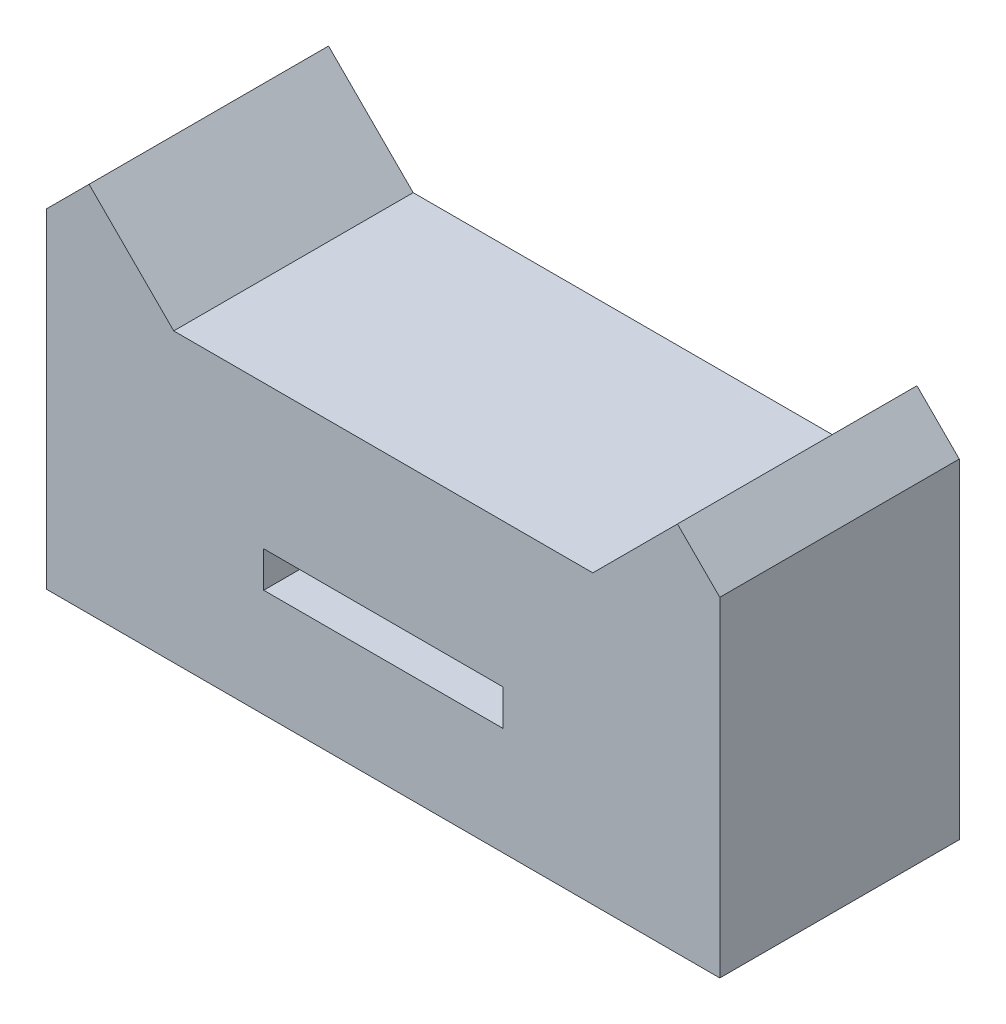
ISO-10303-21;
HEADER;
FILE_DESCRIPTION(('STEP AP214'),'2;1');
FILE_NAME('part.step','',(''),(''),'','','');
FILE_SCHEMA(('AUTOMOTIVE_DESIGN { 1 0 10303 214 1 1 1 1 }'));
ENDSEC;
DATA;
#1=APPLICATION_CONTEXT('core data for automotive mechanical design processes');
#2=APPLICATION_PROTOCOL_DEFINITION('international standard','automotive_design',2000,#1);
#3=PRODUCT_CONTEXT('',#1,'mechanical');
#4=PRODUCT('Part','Part','',(#3));
#5=PRODUCT_RELATED_PRODUCT_CATEGORY('part','',(#4));
#6=PRODUCT_DEFINITION_FORMATION('','',#4);
#7=PRODUCT_DEFINITION_CONTEXT('part definition',#1,'design');
#8=PRODUCT_DEFINITION('design','',#6,#7);
#9=PRODUCT_DEFINITION_SHAPE('','',#8);
#10=(LENGTH_UNIT() NAMED_UNIT(*) SI_UNIT(.MILLI.,.METRE.));
#11=(NAMED_UNIT(*) PLANE_ANGLE_UNIT() SI_UNIT($,.RADIAN.));
#12=(NAMED_UNIT(*) SI_UNIT($,.STERADIAN.) SOLID_ANGLE_UNIT());
#13=UNCERTAINTY_MEASURE_WITH_UNIT(LENGTH_MEASURE(1.E-05),#10,'distance_accuracy_value','');
#14=(GEOMETRIC_REPRESENTATION_CONTEXT(3) GLOBAL_UNCERTAINTY_ASSIGNED_CONTEXT((#13)) GLOBAL_UNIT_ASSIGNED_CONTEXT((#10,
#11,#12)) REPRESENTATION_CONTEXT('',''));
#15=CARTESIAN_POINT('',(0.,0.,0.));
#16=DIRECTION('',(0.,0.,1.));
#17=DIRECTION('',(1.,0.,0.));
#18=AXIS2_PLACEMENT_3D('',#15,#16,#17);
#19=CARTESIAN_POINT('',(0.,0.,10.));
#20=DIRECTION('',(0.,0.,-1.));
#21=DIRECTION('',(-1.,0.,0.));
#22=AXIS2_PLACEMENT_3D('',#19,#20,#21);
#23=PLANE('',#22);
#24=DIRECTION('',(-1.,0.,0.));
#25=VECTOR('',#24,1.);
#26=CARTESIAN_POINT('',(0.,-45.,10.));
#27=LINE('',#26,#25);
#28=CARTESIAN_POINT('',(28.1066017177982,-45.,9.9999999999998));
#29=VERTEX_POINT('',#28);
#30=CARTESIAN_POINT('',(-28.1066017177982,-45.,10.0000000000002));
#31=VERTEX_POINT('',#30);
#32=EDGE_CURVE('E213',#29,#31,#27,.T.);
#33=ORIENTED_EDGE('',*,*,#32,.F.);
#34=DIRECTION('',(0.,-1.,0.));
#35=VECTOR('',#34,1.);
#36=CARTESIAN_POINT('',(28.1066017177983,0.,9.9999999999998));
#37=LINE('',#36,#35);
#38=CARTESIAN_POINT('',(28.1066017177983,-17.4644660940672,9.9999999999998));
#39=VERTEX_POINT('',#38);
#40=EDGE_CURVE('E236',#39,#29,#37,.T.);
#41=ORIENTED_EDGE('',*,*,#40,.F.);
#42=DIRECTION('',(0.707106781186548,-0.707106781186548,0.));
#43=VECTOR('',#42,1.);
#44=CARTESIAN_POINT('',(5.32106781186554,5.32106781186547,9.99999999999996));
#45=LINE('',#44,#43);
#46=CARTESIAN_POINT('',(24.5710678118655,-13.9289321881345,9.99999999999983));
#47=VERTEX_POINT('',#46);
#48=EDGE_CURVE('E232',#47,#39,#45,.T.);
#49=ORIENTED_EDGE('',*,*,#48,.F.);
#50=DIRECTION('',(0.707106781186548,0.707106781186547,0.));
#51=VECTOR('',#50,1.);
#52=CARTESIAN_POINT('',(19.2500000000001,-19.25,9.99999999999987));
#53=LINE('',#52,#51);
#54=CARTESIAN_POINT('',(17.5000000000001,-21.,9.99999999999988));
#55=VERTEX_POINT('',#54);
#56=EDGE_CURVE('E228',#55,#47,#53,.T.);
#57=ORIENTED_EDGE('',*,*,#56,.F.);
#58=DIRECTION('',(-1.,0.,0.));
#59=VECTOR('',#58,1.);
#60=CARTESIAN_POINT('',(0.,-21.,10.));
#61=LINE('',#60,#59);
#62=CARTESIAN_POINT('',(-17.4999999999999,-21.,10.0000000000001));
#63=VERTEX_POINT('',#62);
#64=EDGE_CURVE('E225',#55,#63,#61,.T.);
#65=ORIENTED_EDGE('',*,*,#64,.T.);
#66=DIRECTION('',(-0.707106781186548,0.707106781186548,0.));
#67=VECTOR('',#66,1.);
#68=CARTESIAN_POINT('',(-19.2499999999999,-19.25,10.0000000000001));
#69=LINE('',#68,#67);
#70=CARTESIAN_POINT('',(-24.5710678118654,-13.9289321881345,10.0000000000002));
#71=VERTEX_POINT('',#70);
#72=EDGE_CURVE('E222',#63,#71,#69,.T.);
#73=ORIENTED_EDGE('',*,*,#72,.T.);
#74=DIRECTION('',(-0.707106781186548,-0.707106781186547,0.));
#75=VECTOR('',#74,1.);
#76=CARTESIAN_POINT('',(-5.3210678118654,5.32106781186547,10.));
#77=LINE('',#76,#75);
#78=CARTESIAN_POINT('',(-28.1066017177981,-17.4644660940673,10.0000000000002));
#79=VERTEX_POINT('',#78);
#80=EDGE_CURVE('E219',#71,#79,#77,.T.);
#81=ORIENTED_EDGE('',*,*,#80,.T.);
#82=DIRECTION('',(0.,-1.,0.));
#83=VECTOR('',#82,1.);
#84=CARTESIAN_POINT('',(-28.1066017177981,0.,10.0000000000002));
#85=LINE('',#84,#83);
#86=EDGE_CURVE('E216',#79,#31,#85,.T.);
#87=ORIENTED_EDGE('',*,*,#86,.T.);
#88=EDGE_LOOP('',(#33,#41,#49,#57,#65,#73,#81,#87));
#89=FACE_BOUND('',#88,.T.);
#90=DIRECTION('',(1.,0.,0.));
#91=VECTOR('',#90,1.);
#92=CARTESIAN_POINT('',(0.,-33.,10.));
#93=LINE('',#92,#91);
#94=CARTESIAN_POINT('',(-9.98477558685087,-33.,10.0000000000001));
#95=VERTEX_POINT('',#94);
#96=CARTESIAN_POINT('',(10.0000000000001,-33.,9.99999999999993));
#97=VERTEX_POINT('',#96);
#98=EDGE_CURVE('E58',#95,#97,#93,.T.);
#99=ORIENTED_EDGE('',*,*,#98,.T.);
#100=DIRECTION('',(0.,-1.,0.));
#101=VECTOR('',#100,1.);
#102=CARTESIAN_POINT('',(10.0000000000001,0.,9.99999999999993));
#103=LINE('',#102,#101);
#104=CARTESIAN_POINT('',(10.0000000000001,-36.,9.99999999999993));
#105=VERTEX_POINT('',#104);
#106=EDGE_CURVE('E154',#97,#105,#103,.T.);
#107=ORIENTED_EDGE('',*,*,#106,.T.);
#108=DIRECTION('',(-1.,0.,0.));
#109=VECTOR('',#108,1.);
#110=CARTESIAN_POINT('',(0.,-36.,10.));
#111=LINE('',#110,#109);
#112=CARTESIAN_POINT('',(-9.98477558685087,-36.,10.0000000000001));
#113=VERTEX_POINT('',#112);
#114=EDGE_CURVE('E158',#105,#113,#111,.T.);
#115=ORIENTED_EDGE('',*,*,#114,.T.);
#116=DIRECTION('',(0.,1.,0.));
#117=VECTOR('',#116,1.);
#118=CARTESIAN_POINT('',(-9.98477558685087,0.,10.0000000000001));
#119=LINE('',#118,#117);
#120=EDGE_CURVE('E167',#113,#95,#119,.T.);
#121=ORIENTED_EDGE('',*,*,#120,.T.);
#122=EDGE_LOOP('',(#99,#107,#115,#121));
#123=FACE_BOUND('',#122,.T.);
#124=ADVANCED_FACE('F40',(#89,#123),#23,.F.);
#125=CARTESIAN_POINT('',(0.,-45.,10.));
#126=DIRECTION('',(0.,-1.,0.));
#127=DIRECTION('',(0.,0.,1.));
#128=AXIS2_PLACEMENT_3D('',#125,#126,#127);
#129=PLANE('',#128);
#130=DIRECTION('',(0.,0.,-1.));
#131=VECTOR('',#130,1.);
#132=CARTESIAN_POINT('',(-28.1066017177982,-45.,10.0000000000002));
#133=LINE('',#132,#131);
#134=CARTESIAN_POINT('',(-28.1066017177983,-45.,-9.9999999999998));
#135=VERTEX_POINT('',#134);
#136=EDGE_CURVE('E44',#31,#135,#133,.T.);
#137=ORIENTED_EDGE('',*,*,#136,.T.);
#138=DIRECTION('',(-1.,0.,0.));
#139=VECTOR('',#138,1.);
#140=CARTESIAN_POINT('',(0.,-45.,-10.));
#141=LINE('',#140,#139);
#142=CARTESIAN_POINT('',(28.1066017177981,-45.,-10.0000000000002));
#143=VERTEX_POINT('',#142);
#144=EDGE_CURVE('E176',#143,#135,#141,.T.);
#145=ORIENTED_EDGE('',*,*,#144,.F.);
#146=DIRECTION('',(0.,0.,-1.));
#147=VECTOR('',#146,1.);
#148=CARTESIAN_POINT('',(28.1066017177982,-45.,9.9999999999998));
#149=LINE('',#148,#147);
#150=EDGE_CURVE('E11',#29,#143,#149,.T.);
#151=ORIENTED_EDGE('',*,*,#150,.F.);
#152=ORIENTED_EDGE('',*,*,#32,.T.);
#153=EDGE_LOOP('',(#137,#145,#151,#152));
#154=FACE_BOUND('',#153,.T.);
#155=ADVANCED_FACE('F42',(#154),#129,.T.);
#156=CARTESIAN_POINT('',(28.1066017177983,0.,9.9999999999998));
#157=DIRECTION('',(1.,0.,0.));
#158=DIRECTION('',(0.,-1.,0.));
#159=AXIS2_PLACEMENT_3D('',#156,#157,#158);
#160=PLANE('',#159);
#161=ORIENTED_EDGE('',*,*,#150,.T.);
#162=DIRECTION('',(0.,-1.,0.));
#163=VECTOR('',#162,1.);
#164=CARTESIAN_POINT('',(28.1066017177981,0.,-10.0000000000002));
#165=LINE('',#164,#163);
#166=CARTESIAN_POINT('',(28.1066017177981,-17.4644660940672,-10.0000000000002));
#167=VERTEX_POINT('',#166);
#168=EDGE_CURVE('E209',#167,#143,#165,.T.);
#169=ORIENTED_EDGE('',*,*,#168,.F.);
#170=DIRECTION('',(0.,0.,-1.));
#171=VECTOR('',#170,1.);
#172=CARTESIAN_POINT('',(28.1066017177983,-17.4644660940672,9.9999999999998));
#173=LINE('',#172,#171);
#174=EDGE_CURVE('E50',#39,#167,#173,.T.);
#175=ORIENTED_EDGE('',*,*,#174,.F.);
#176=ORIENTED_EDGE('',*,*,#40,.T.);
#177=EDGE_LOOP('',(#161,#169,#175,#176));
#178=FACE_BOUND('',#177,.T.);
#179=ADVANCED_FACE('F282',(#178),#160,.T.);
#180=CARTESIAN_POINT('',(5.32106781186554,5.32106781186547,9.99999999999996));
#181=DIRECTION('',(0.707106781186548,0.707106781186548,0.));
#182=DIRECTION('',(0.707106781186548,-0.707106781186548,0.));
#183=AXIS2_PLACEMENT_3D('',#180,#181,#182);
#184=PLANE('',#183);
#185=ORIENTED_EDGE('',*,*,#174,.T.);
#186=DIRECTION('',(0.707106781186548,-0.707106781186548,0.));
#187=VECTOR('',#186,1.);
#188=CARTESIAN_POINT('',(5.3210678118654,5.32106781186547,-10.));
#189=LINE('',#188,#187);
#190=CARTESIAN_POINT('',(24.5710678118654,-13.9289321881345,-10.0000000000002));
#191=VERTEX_POINT('',#190);
#192=EDGE_CURVE('E205',#191,#167,#189,.T.);
#193=ORIENTED_EDGE('',*,*,#192,.F.);
#194=DIRECTION('',(0.,0.,-1.));
#195=VECTOR('',#194,1.);
#196=CARTESIAN_POINT('',(24.5710678118655,-13.9289321881345,9.99999999999983));
#197=LINE('',#196,#195);
#198=EDGE_CURVE('E242',#47,#191,#197,.T.);
#199=ORIENTED_EDGE('',*,*,#198,.F.);
#200=ORIENTED_EDGE('',*,*,#48,.T.);
#201=EDGE_LOOP('',(#185,#193,#199,#200));
#202=FACE_BOUND('',#201,.T.);
#203=ADVANCED_FACE('F288',(#202),#184,.T.);
#204=CARTESIAN_POINT('',(19.2500000000001,-19.25,9.99999999999987));
#205=DIRECTION('',(-0.707106781186547,0.707106781186548,0.));
#206=DIRECTION('',(0.707106781186548,0.707106781186547,0.));
#207=AXIS2_PLACEMENT_3D('',#204,#205,#206);
#208=PLANE('',#207);
#209=ORIENTED_EDGE('',*,*,#198,.T.);
#210=DIRECTION('',(0.707106781186548,0.707106781186547,0.));
#211=VECTOR('',#210,1.);
#212=CARTESIAN_POINT('',(19.2499999999999,-19.25,-10.0000000000001));
#213=LINE('',#212,#211);
#214=CARTESIAN_POINT('',(17.4999999999999,-21.,-10.0000000000001));
#215=VERTEX_POINT('',#214);
#216=EDGE_CURVE('E201',#215,#191,#213,.T.);
#217=ORIENTED_EDGE('',*,*,#216,.F.);
#218=DIRECTION('',(0.,0.,-1.));
#219=VECTOR('',#218,1.);
#220=CARTESIAN_POINT('',(17.5000000000001,-21.,9.99999999999988));
#221=LINE('',#220,#219);
#222=EDGE_CURVE('E245',#55,#215,#221,.T.);
#223=ORIENTED_EDGE('',*,*,#222,.F.);
#224=ORIENTED_EDGE('',*,*,#56,.T.);
#225=EDGE_LOOP('',(#209,#217,#223,#224));
#226=FACE_BOUND('',#225,.T.);
#227=ADVANCED_FACE('F292',(#226),#208,.T.);
#228=CARTESIAN_POINT('',(0.,-21.,10.));
#229=DIRECTION('',(0.,-1.,0.));
#230=DIRECTION('',(0.,0.,1.));
#231=AXIS2_PLACEMENT_3D('',#228,#229,#230);
#232=PLANE('',#231);
#233=ORIENTED_EDGE('',*,*,#222,.T.);
#234=DIRECTION('',(-1.,0.,0.));
#235=VECTOR('',#234,1.);
#236=CARTESIAN_POINT('',(0.,-21.,-10.));
#237=LINE('',#236,#235);
#238=CARTESIAN_POINT('',(-17.5000000000001,-21.,-9.99999999999988));
#239=VERTEX_POINT('',#238);
#240=EDGE_CURVE('E197',#215,#239,#237,.T.);
#241=ORIENTED_EDGE('',*,*,#240,.T.);
#242=DIRECTION('',(0.,0.,-1.));
#243=VECTOR('',#242,1.);
#244=CARTESIAN_POINT('',(-17.4999999999999,-21.,10.0000000000001));
#245=LINE('',#244,#243);
#246=EDGE_CURVE('E248',#63,#239,#245,.T.);
#247=ORIENTED_EDGE('',*,*,#246,.F.);
#248=ORIENTED_EDGE('',*,*,#64,.F.);
#249=EDGE_LOOP('',(#233,#241,#247,#248));
#250=FACE_BOUND('',#249,.T.);
#251=ADVANCED_FACE('F296',(#250),#232,.F.);
#252=CARTESIAN_POINT('',(-19.2499999999999,-19.25,10.0000000000001));
#253=DIRECTION('',(-0.707106781186548,-0.707106781186548,0.));
#254=DIRECTION('',(-0.707106781186548,0.707106781186548,0.));
#255=AXIS2_PLACEMENT_3D('',#252,#253,#254);
#256=PLANE('',#255);
#257=ORIENTED_EDGE('',*,*,#246,.T.);
#258=DIRECTION('',(-0.707106781186548,0.707106781186548,0.));
#259=VECTOR('',#258,1.);
#260=CARTESIAN_POINT('',(-19.2500000000001,-19.25,-9.99999999999987));
#261=LINE('',#260,#259);
#262=CARTESIAN_POINT('',(-24.5710678118656,-13.9289321881345,-9.99999999999983));
#263=VERTEX_POINT('',#262);
#264=EDGE_CURVE('E193',#239,#263,#261,.T.);
#265=ORIENTED_EDGE('',*,*,#264,.T.);
#266=DIRECTION('',(0.,0.,-1.));
#267=VECTOR('',#266,1.);
#268=CARTESIAN_POINT('',(-24.5710678118654,-13.9289321881345,10.0000000000002));
#269=LINE('',#268,#267);
#270=EDGE_CURVE('E251',#71,#263,#269,.T.);
#271=ORIENTED_EDGE('',*,*,#270,.F.);
#272=ORIENTED_EDGE('',*,*,#72,.F.);
#273=EDGE_LOOP('',(#257,#265,#271,#272));
#274=FACE_BOUND('',#273,.T.);
#275=ADVANCED_FACE('F273',(#274),#256,.F.);
#276=CARTESIAN_POINT('',(-5.3210678118654,5.32106781186547,10.));
#277=DIRECTION('',(0.707106781186547,-0.707106781186548,0.));
#278=DIRECTION('',(-0.707106781186548,-0.707106781186547,0.));
#279=AXIS2_PLACEMENT_3D('',#276,#277,#278);
#280=PLANE('',#279);
#281=ORIENTED_EDGE('',*,*,#270,.T.);
#282=DIRECTION('',(-0.707106781186548,-0.707106781186547,0.));
#283=VECTOR('',#282,1.);
#284=CARTESIAN_POINT('',(-5.32106781186554,5.32106781186547,-9.99999999999996));
#285=LINE('',#284,#283);
#286=CARTESIAN_POINT('',(-28.1066017177983,-17.4644660940673,-9.9999999999998));
#287=VERTEX_POINT('',#286);
#288=EDGE_CURVE('E189',#263,#287,#285,.T.);
#289=ORIENTED_EDGE('',*,*,#288,.T.);
#290=DIRECTION('',(0.,0.,-1.));
#291=VECTOR('',#290,1.);
#292=CARTESIAN_POINT('',(-28.1066017177981,-17.4644660940673,10.0000000000002));
#293=LINE('',#292,#291);
#294=EDGE_CURVE('E253',#79,#287,#293,.T.);
#295=ORIENTED_EDGE('',*,*,#294,.F.);
#296=ORIENTED_EDGE('',*,*,#80,.F.);
#297=EDGE_LOOP('',(#281,#289,#295,#296));
#298=FACE_BOUND('',#297,.T.);
#299=ADVANCED_FACE('F267',(#298),#280,.F.);
#300=CARTESIAN_POINT('',(-28.1066017177981,0.,10.0000000000002));
#301=DIRECTION('',(1.,0.,0.));
#302=DIRECTION('',(0.,-1.,0.));
#303=AXIS2_PLACEMENT_3D('',#300,#301,#302);
#304=PLANE('',#303);
#305=ORIENTED_EDGE('',*,*,#294,.T.);
#306=DIRECTION('',(0.,-1.,0.));
#307=VECTOR('',#306,1.);
#308=CARTESIAN_POINT('',(-28.1066017177983,0.,-9.9999999999998));
#309=LINE('',#308,#307);
#310=EDGE_CURVE('E185',#287,#135,#309,.T.);
#311=ORIENTED_EDGE('',*,*,#310,.T.);
#312=ORIENTED_EDGE('',*,*,#136,.F.);
#313=ORIENTED_EDGE('',*,*,#86,.F.);
#314=EDGE_LOOP('',(#305,#311,#312,#313));
#315=FACE_BOUND('',#314,.T.);
#316=ADVANCED_FACE('F265',(#315),#304,.F.);
#317=CARTESIAN_POINT('',(0.,0.,-10.));
#318=DIRECTION('',(0.,0.,-1.));
#319=DIRECTION('',(-1.,0.,0.));
#320=AXIS2_PLACEMENT_3D('',#317,#318,#319);
#321=PLANE('',#320);
#322=ORIENTED_EDGE('',*,*,#144,.T.);
#323=ORIENTED_EDGE('',*,*,#310,.F.);
#324=ORIENTED_EDGE('',*,*,#288,.F.);
#325=ORIENTED_EDGE('',*,*,#264,.F.);
#326=ORIENTED_EDGE('',*,*,#240,.F.);
#327=ORIENTED_EDGE('',*,*,#216,.T.);
#328=ORIENTED_EDGE('',*,*,#192,.T.);
#329=ORIENTED_EDGE('',*,*,#168,.T.);
#330=EDGE_LOOP('',(#322,#323,#324,#325,#326,#327,#328,#329));
#331=FACE_BOUND('',#330,.T.);
#332=ADVANCED_FACE('F262',(#331),#321,.T.);
#333=CARTESIAN_POINT('',(0.,-33.,0.));
#334=DIRECTION('',(0.,-1.,0.));
#335=DIRECTION('',(0.,0.,1.));
#336=AXIS2_PLACEMENT_3D('',#333,#334,#335);
#337=PLANE('',#336);
#338=ORIENTED_EDGE('',*,*,#98,.F.);
#339=DIRECTION('',(0.,0.,1.));
#340=VECTOR('',#339,1.);
#341=CARTESIAN_POINT('',(-9.98477558685093,-33.,0.));
#342=LINE('',#341,#340);
#343=CARTESIAN_POINT('',(-9.98477558685093,-33.,0.));
#344=VERTEX_POINT('',#343);
#345=EDGE_CURVE('E136',#344,#95,#342,.T.);
#346=ORIENTED_EDGE('',*,*,#345,.F.);
#347=DIRECTION('',(1.,0.,0.));
#348=VECTOR('',#347,1.);
#349=CARTESIAN_POINT('',(0.,-33.,0.));
#350=LINE('',#349,#348);
#351=CARTESIAN_POINT('',(10.,-33.,0.));
#352=VERTEX_POINT('',#351);
#353=EDGE_CURVE('E144',#344,#352,#350,.T.);
#354=ORIENTED_EDGE('',*,*,#353,.T.);
#355=DIRECTION('',(0.,0.,1.));
#356=VECTOR('',#355,1.);
#357=CARTESIAN_POINT('',(10.,-33.,0.));
#358=LINE('',#357,#356);
#359=EDGE_CURVE('E173',#352,#97,#358,.T.);
#360=ORIENTED_EDGE('',*,*,#359,.T.);
#361=EDGE_LOOP('',(#338,#346,#354,#360));
#362=FACE_BOUND('',#361,.T.);
#363=ADVANCED_FACE('F147',(#362),#337,.T.);
#364=CARTESIAN_POINT('',(10.,0.,0.));
#365=DIRECTION('',(-1.,0.,0.));
#366=DIRECTION('',(0.,0.,1.));
#367=AXIS2_PLACEMENT_3D('',#364,#365,#366);
#368=PLANE('',#367);
#369=ORIENTED_EDGE('',*,*,#106,.F.);
#370=ORIENTED_EDGE('',*,*,#359,.F.);
#371=DIRECTION('',(0.,-1.,0.));
#372=VECTOR('',#371,1.);
#373=CARTESIAN_POINT('',(10.,0.,0.));
#374=LINE('',#373,#372);
#375=CARTESIAN_POINT('',(10.,-36.,0.));
#376=VERTEX_POINT('',#375);
#377=EDGE_CURVE('E150',#352,#376,#374,.T.);
#378=ORIENTED_EDGE('',*,*,#377,.T.);
#379=DIRECTION('',(0.,0.,1.));
#380=VECTOR('',#379,1.);
#381=CARTESIAN_POINT('',(10.,-36.,0.));
#382=LINE('',#381,#380);
#383=EDGE_CURVE('E177',#376,#105,#382,.T.);
#384=ORIENTED_EDGE('',*,*,#383,.T.);
#385=EDGE_LOOP('',(#369,#370,#378,#384));
#386=FACE_BOUND('',#385,.T.);
#387=ADVANCED_FACE('F396',(#386),#368,.T.);
#388=CARTESIAN_POINT('',(0.,-36.,0.));
#389=DIRECTION('',(0.,1.,0.));
#390=DIRECTION('',(0.,0.,-1.));
#391=AXIS2_PLACEMENT_3D('',#388,#389,#390);
#392=PLANE('',#391);
#393=ORIENTED_EDGE('',*,*,#114,.F.);
#394=ORIENTED_EDGE('',*,*,#383,.F.);
#395=DIRECTION('',(-1.,0.,0.));
#396=VECTOR('',#395,1.);
#397=CARTESIAN_POINT('',(0.,-36.,0.));
#398=LINE('',#397,#396);
#399=CARTESIAN_POINT('',(-9.98477558685093,-36.,0.));
#400=VERTEX_POINT('',#399);
#401=EDGE_CURVE('E143',#376,#400,#398,.T.);
#402=ORIENTED_EDGE('',*,*,#401,.T.);
#403=DIRECTION('',(0.,0.,1.));
#404=VECTOR('',#403,1.);
#405=CARTESIAN_POINT('',(-9.98477558685093,-36.,0.));
#406=LINE('',#405,#404);
#407=EDGE_CURVE('E138',#400,#113,#406,.T.);
#408=ORIENTED_EDGE('',*,*,#407,.T.);
#409=EDGE_LOOP('',(#393,#394,#402,#408));
#410=FACE_BOUND('',#409,.T.);
#411=ADVANCED_FACE('F402',(#410),#392,.T.);
#412=CARTESIAN_POINT('',(-9.98477558685093,0.,0.));
#413=DIRECTION('',(1.,0.,0.));
#414=DIRECTION('',(0.,0.,-1.));
#415=AXIS2_PLACEMENT_3D('',#412,#413,#414);
#416=PLANE('',#415);
#417=ORIENTED_EDGE('',*,*,#120,.F.);
#418=ORIENTED_EDGE('',*,*,#407,.F.);
#419=DIRECTION('',(0.,1.,0.));
#420=VECTOR('',#419,1.);
#421=CARTESIAN_POINT('',(-9.98477558685093,0.,0.));
#422=LINE('',#421,#420);
#423=EDGE_CURVE('E133',#400,#344,#422,.T.);
#424=ORIENTED_EDGE('',*,*,#423,.T.);
#425=ORIENTED_EDGE('',*,*,#345,.T.);
#426=EDGE_LOOP('',(#417,#418,#424,#425));
#427=FACE_BOUND('',#426,.T.);
#428=ADVANCED_FACE('F135',(#427),#416,.T.);
#429=CARTESIAN_POINT('',(0.,0.,0.));
#430=DIRECTION('',(0.,0.,1.));
#431=DIRECTION('',(1.,0.,0.));
#432=AXIS2_PLACEMENT_3D('',#429,#430,#431);
#433=PLANE('',#432);
#434=ORIENTED_EDGE('',*,*,#353,.F.);
#435=ORIENTED_EDGE('',*,*,#423,.F.);
#436=ORIENTED_EDGE('',*,*,#401,.F.);
#437=ORIENTED_EDGE('',*,*,#377,.F.);
#438=EDGE_LOOP('',(#434,#435,#436,#437));
#439=FACE_BOUND('',#438,.T.);
#440=ADVANCED_FACE('F152',(#439),#433,.T.);
#441=CLOSED_SHELL('',(#124,#155,#179,#203,#227,#251,#275,#299,#316,#332,#363,#387,#411,#428,#440));
#442=MANIFOLD_SOLID_BREP('B2',#441);
#443=ADVANCED_BREP_SHAPE_REPRESENTATION('',(#18,#442),#14);
#444=SHAPE_DEFINITION_REPRESENTATION(#9,#443);
ENDSEC;
END-ISO-10303-21;
